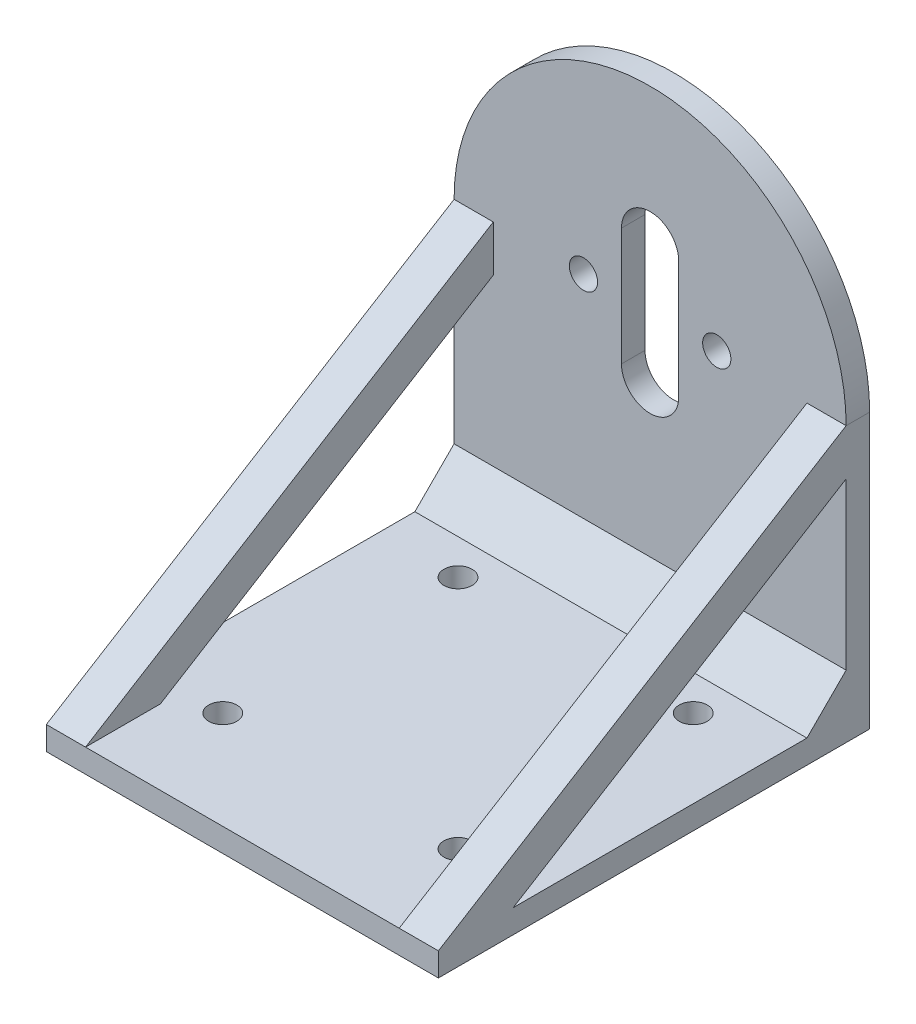
ISO-10303-21;
HEADER;
FILE_DESCRIPTION(('STEP AP214'),'2;1');
FILE_NAME('part.step','',(''),(''),'','','');
FILE_SCHEMA(('AUTOMOTIVE_DESIGN { 1 0 10303 214 1 1 1 1 }'));
ENDSEC;
DATA;
#1=APPLICATION_CONTEXT('core data for automotive mechanical design processes');
#2=APPLICATION_PROTOCOL_DEFINITION('international standard','automotive_design',2000,#1);
#3=PRODUCT_CONTEXT('',#1,'mechanical');
#4=PRODUCT('Part','Part','',(#3));
#5=PRODUCT_RELATED_PRODUCT_CATEGORY('part','',(#4));
#6=PRODUCT_DEFINITION_FORMATION('','',#4);
#7=PRODUCT_DEFINITION_CONTEXT('part definition',#1,'design');
#8=PRODUCT_DEFINITION('design','',#6,#7);
#9=PRODUCT_DEFINITION_SHAPE('','',#8);
#10=(LENGTH_UNIT() NAMED_UNIT(*) SI_UNIT(.MILLI.,.METRE.));
#11=(NAMED_UNIT(*) PLANE_ANGLE_UNIT() SI_UNIT($,.RADIAN.));
#12=(NAMED_UNIT(*) SI_UNIT($,.STERADIAN.) SOLID_ANGLE_UNIT());
#13=UNCERTAINTY_MEASURE_WITH_UNIT(LENGTH_MEASURE(1.E-05),#10,'distance_accuracy_value','');
#14=(GEOMETRIC_REPRESENTATION_CONTEXT(3) GLOBAL_UNCERTAINTY_ASSIGNED_CONTEXT((#13)) GLOBAL_UNIT_ASSIGNED_CONTEXT((#10,
#11,#12)) REPRESENTATION_CONTEXT('',''));
#15=CARTESIAN_POINT('',(0.,0.,0.));
#16=DIRECTION('',(0.,0.,1.));
#17=DIRECTION('',(1.,0.,0.));
#18=AXIS2_PLACEMENT_3D('',#15,#16,#17);
#19=CARTESIAN_POINT('',(25.,35.,3.));
#20=DIRECTION('',(0.,0.,1.));
#21=DIRECTION('',(1.,0.,0.));
#22=AXIS2_PLACEMENT_3D('',#19,#20,#21);
#23=PLANE('',#22);
#24=CARTESIAN_POINT('',(16.5,35.,3.));
#25=DIRECTION('',(0.,0.,1.));
#26=DIRECTION('',(1.,0.,0.));
#27=AXIS2_PLACEMENT_3D('',#24,#25,#26);
#28=CIRCLE('',#27,1.8);
#29=CARTESIAN_POINT('',(18.3,35.,3.));
#30=VERTEX_POINT('',#29);
#31=EDGE_CURVE('E296',#30,#30,#28,.T.);
#32=ORIENTED_EDGE('',*,*,#31,.F.);
#33=EDGE_LOOP('',(#32));
#34=FACE_BOUND('',#33,.T.);
#35=CARTESIAN_POINT('',(33.5,35.,3.));
#36=DIRECTION('',(0.,0.,1.));
#37=DIRECTION('',(1.,0.,0.));
#38=AXIS2_PLACEMENT_3D('',#35,#36,#37);
#39=CIRCLE('',#38,1.8);
#40=CARTESIAN_POINT('',(35.3,35.,3.));
#41=VERTEX_POINT('',#40);
#42=EDGE_CURVE('E290',#41,#41,#39,.T.);
#43=ORIENTED_EDGE('',*,*,#42,.F.);
#44=EDGE_LOOP('',(#43));
#45=FACE_BOUND('',#44,.T.);
#46=DIRECTION('',(0.,-1.,0.));
#47=VECTOR('',#46,1.);
#48=CARTESIAN_POINT('',(21.35,42.5,3.));
#49=LINE('',#48,#47);
#50=CARTESIAN_POINT('',(21.35,42.5,3.));
#51=VERTEX_POINT('',#50);
#52=CARTESIAN_POINT('',(21.35,27.5,3.));
#53=VERTEX_POINT('',#52);
#54=EDGE_CURVE('E261',#51,#53,#49,.T.);
#55=ORIENTED_EDGE('',*,*,#54,.F.);
#56=CARTESIAN_POINT('',(25.,42.5,3.));
#57=DIRECTION('',(0.,0.,1.));
#58=DIRECTION('',(1.,0.,0.));
#59=AXIS2_PLACEMENT_3D('',#56,#57,#58);
#60=CIRCLE('',#59,3.65);
#61=CARTESIAN_POINT('',(28.65,42.5,3.));
#62=VERTEX_POINT('',#61);
#63=EDGE_CURVE('E259',#62,#51,#60,.T.);
#64=ORIENTED_EDGE('',*,*,#63,.F.);
#65=DIRECTION('',(0.,1.,0.));
#66=VECTOR('',#65,1.);
#67=CARTESIAN_POINT('',(28.65,42.5,3.));
#68=LINE('',#67,#66);
#69=CARTESIAN_POINT('',(28.65,27.5,3.));
#70=VERTEX_POINT('',#69);
#71=EDGE_CURVE('E267',#70,#62,#68,.T.);
#72=ORIENTED_EDGE('',*,*,#71,.F.);
#73=CARTESIAN_POINT('',(25.,27.5,3.));
#74=DIRECTION('',(0.,0.,1.));
#75=DIRECTION('',(1.,0.,0.));
#76=AXIS2_PLACEMENT_3D('',#73,#74,#75);
#77=CIRCLE('',#76,3.65);
#78=EDGE_CURVE('E264',#53,#70,#77,.T.);
#79=ORIENTED_EDGE('',*,*,#78,.F.);
#80=EDGE_LOOP('',(#55,#64,#72,#79));
#81=FACE_BOUND('',#80,.T.);
#82=DIRECTION('',(0.,-1.,0.));
#83=VECTOR('',#82,1.);
#84=CARTESIAN_POINT('',(0.,0.,3.));
#85=LINE('',#84,#83);
#86=CARTESIAN_POINT('',(0.,29.1291009528947,3.));
#87=VERTEX_POINT('',#86);
#88=CARTESIAN_POINT('',(0.,8.,3.));
#89=VERTEX_POINT('',#88);
#90=EDGE_CURVE('E307',#87,#89,#85,.T.);
#91=ORIENTED_EDGE('',*,*,#90,.T.);
#92=DIRECTION('',(1.,0.,0.));
#93=VECTOR('',#92,1.);
#94=CARTESIAN_POINT('',(50.,8.,3.));
#95=LINE('',#94,#93);
#96=CARTESIAN_POINT('',(50.,8.,3.));
#97=VERTEX_POINT('',#96);
#98=EDGE_CURVE('E57',#89,#97,#95,.T.);
#99=ORIENTED_EDGE('',*,*,#98,.T.);
#100=DIRECTION('',(0.,1.,0.));
#101=VECTOR('',#100,1.);
#102=CARTESIAN_POINT('',(50.,0.,3.));
#103=LINE('',#102,#101);
#104=CARTESIAN_POINT('',(50.,29.1291009528947,3.));
#105=VERTEX_POINT('',#104);
#106=EDGE_CURVE('E302',#97,#105,#103,.T.);
#107=ORIENTED_EDGE('',*,*,#106,.T.);
#108=DIRECTION('',(1.,0.,0.));
#109=VECTOR('',#108,1.);
#110=CARTESIAN_POINT('',(45.,29.1291009528947,3.));
#111=LINE('',#110,#109);
#112=CARTESIAN_POINT('',(45.,29.1291009528947,3.));
#113=VERTEX_POINT('',#112);
#114=EDGE_CURVE('E212',#113,#105,#111,.T.);
#115=ORIENTED_EDGE('',*,*,#114,.F.);
#116=DIRECTION('',(0.,1.,0.));
#117=VECTOR('',#116,1.);
#118=CARTESIAN_POINT('',(45.,29.1291009528947,3.));
#119=LINE('',#118,#117);
#120=CARTESIAN_POINT('',(45.,35.,3.));
#121=VERTEX_POINT('',#120);
#122=EDGE_CURVE('E195',#113,#121,#119,.T.);
#123=ORIENTED_EDGE('',*,*,#122,.T.);
#124=DIRECTION('',(1.,0.,0.));
#125=VECTOR('',#124,1.);
#126=CARTESIAN_POINT('',(45.,35.,3.));
#127=LINE('',#126,#125);
#128=CARTESIAN_POINT('',(50.,35.,3.));
#129=VERTEX_POINT('',#128);
#130=EDGE_CURVE('E207',#121,#129,#127,.T.);
#131=ORIENTED_EDGE('',*,*,#130,.T.);
#132=CARTESIAN_POINT('',(25.,35.,3.));
#133=DIRECTION('',(0.,0.,1.));
#134=DIRECTION('',(1.,0.,0.));
#135=AXIS2_PLACEMENT_3D('',#132,#133,#134);
#136=CIRCLE('',#135,25.);
#137=CARTESIAN_POINT('',(0.,35.,3.));
#138=VERTEX_POINT('',#137);
#139=EDGE_CURVE('E304',#129,#138,#136,.T.);
#140=ORIENTED_EDGE('',*,*,#139,.T.);
#141=DIRECTION('',(-1.,0.,0.));
#142=VECTOR('',#141,1.);
#143=CARTESIAN_POINT('',(4.99999999999999,35.,3.));
#144=LINE('',#143,#142);
#145=CARTESIAN_POINT('',(4.99999999999999,35.,3.));
#146=VERTEX_POINT('',#145);
#147=EDGE_CURVE('E190',#146,#138,#144,.T.);
#148=ORIENTED_EDGE('',*,*,#147,.F.);
#149=DIRECTION('',(0.,1.,0.));
#150=VECTOR('',#149,1.);
#151=CARTESIAN_POINT('',(4.99999999999999,29.1291009528947,3.));
#152=LINE('',#151,#150);
#153=CARTESIAN_POINT('',(5.,29.1291009528947,3.));
#154=VERTEX_POINT('',#153);
#155=EDGE_CURVE('E181',#154,#146,#152,.T.);
#156=ORIENTED_EDGE('',*,*,#155,.F.);
#157=DIRECTION('',(-1.,0.,0.));
#158=VECTOR('',#157,1.);
#159=CARTESIAN_POINT('',(4.99999999999999,29.1291009528947,3.));
#160=LINE('',#159,#158);
#161=EDGE_CURVE('E180',#154,#87,#160,.T.);
#162=ORIENTED_EDGE('',*,*,#161,.T.);
#163=EDGE_LOOP('',(#91,#99,#107,#115,#123,#131,#140,#148,#156,#162));
#164=FACE_BOUND('',#163,.T.);
#165=ADVANCED_FACE('F41',(#34,#45,#81,#164),#23,.T.);
#166=CARTESIAN_POINT('',(0.,3.,0.));
#167=DIRECTION('',(0.,1.,0.));
#168=DIRECTION('',(0.,0.,1.));
#169=AXIS2_PLACEMENT_3D('',#166,#167,#168);
#170=PLANE('',#169);
#171=CARTESIAN_POINT('',(40.,3.,12.5));
#172=DIRECTION('',(0.,1.,0.));
#173=DIRECTION('',(0.,0.,1.));
#174=AXIS2_PLACEMENT_3D('',#171,#172,#173);
#175=CIRCLE('',#174,1.79999999999999);
#176=CARTESIAN_POINT('',(40.,3.,14.3));
#177=VERTEX_POINT('',#176);
#178=EDGE_CURVE('E223',#177,#177,#175,.T.);
#179=ORIENTED_EDGE('',*,*,#178,.F.);
#180=EDGE_LOOP('',(#179));
#181=FACE_BOUND('',#180,.T.);
#182=CARTESIAN_POINT('',(40.,3.,42.5));
#183=DIRECTION('',(0.,1.,0.));
#184=DIRECTION('',(0.,0.,1.));
#185=AXIS2_PLACEMENT_3D('',#182,#183,#184);
#186=CIRCLE('',#185,1.79999999999999);
#187=CARTESIAN_POINT('',(40.,3.,44.3));
#188=VERTEX_POINT('',#187);
#189=EDGE_CURVE('E229',#188,#188,#186,.T.);
#190=ORIENTED_EDGE('',*,*,#189,.F.);
#191=EDGE_LOOP('',(#190));
#192=FACE_BOUND('',#191,.T.);
#193=CARTESIAN_POINT('',(10.,3.,12.5));
#194=DIRECTION('',(0.,1.,0.));
#195=DIRECTION('',(0.,0.,1.));
#196=AXIS2_PLACEMENT_3D('',#193,#194,#195);
#197=CIRCLE('',#196,1.79999999999999);
#198=CARTESIAN_POINT('',(10.,3.,14.3));
#199=VERTEX_POINT('',#198);
#200=EDGE_CURVE('E235',#199,#199,#197,.T.);
#201=ORIENTED_EDGE('',*,*,#200,.F.);
#202=EDGE_LOOP('',(#201));
#203=FACE_BOUND('',#202,.T.);
#204=CARTESIAN_POINT('',(10.,3.,42.5));
#205=DIRECTION('',(0.,1.,0.));
#206=DIRECTION('',(0.,0.,1.));
#207=AXIS2_PLACEMENT_3D('',#204,#205,#206);
#208=CIRCLE('',#207,1.79999999999999);
#209=CARTESIAN_POINT('',(10.,3.,44.3));
#210=VERTEX_POINT('',#209);
#211=EDGE_CURVE('E239',#210,#210,#208,.T.);
#212=ORIENTED_EDGE('',*,*,#211,.F.);
#213=EDGE_LOOP('',(#212));
#214=FACE_BOUND('',#213,.T.);
#215=DIRECTION('',(0.,0.,1.));
#216=VECTOR('',#215,1.);
#217=CARTESIAN_POINT('',(50.,3.,0.));
#218=LINE('',#217,#216);
#219=CARTESIAN_POINT('',(50.,3.,8.00000000000004));
#220=VERTEX_POINT('',#219);
#221=CARTESIAN_POINT('',(50.,3.00000000000001,45.4597890484539));
#222=VERTEX_POINT('',#221);
#223=EDGE_CURVE('E244',#220,#222,#218,.T.);
#224=ORIENTED_EDGE('',*,*,#223,.F.);
#225=DIRECTION('',(-1.,0.,0.));
#226=VECTOR('',#225,1.);
#227=CARTESIAN_POINT('',(0.,3.,8.00000000000004));
#228=LINE('',#227,#226);
#229=CARTESIAN_POINT('',(0.,3.,8.00000000000004));
#230=VERTEX_POINT('',#229);
#231=EDGE_CURVE('E328',#220,#230,#228,.T.);
#232=ORIENTED_EDGE('',*,*,#231,.T.);
#233=DIRECTION('',(0.,0.,-1.));
#234=VECTOR('',#233,1.);
#235=CARTESIAN_POINT('',(0.,3.,0.));
#236=LINE('',#235,#234);
#237=CARTESIAN_POINT('',(0.,3.,45.4597890484539));
#238=VERTEX_POINT('',#237);
#239=EDGE_CURVE('E186',#238,#230,#236,.T.);
#240=ORIENTED_EDGE('',*,*,#239,.F.);
#241=DIRECTION('',(-1.,0.,0.));
#242=VECTOR('',#241,1.);
#243=CARTESIAN_POINT('',(5.,3.,45.4597890484539));
#244=LINE('',#243,#242);
#245=CARTESIAN_POINT('',(5.,3.,45.4597890484539));
#246=VERTEX_POINT('',#245);
#247=EDGE_CURVE('E177',#246,#238,#244,.T.);
#248=ORIENTED_EDGE('',*,*,#247,.F.);
#249=DIRECTION('',(0.,0.,-1.));
#250=VECTOR('',#249,1.);
#251=CARTESIAN_POINT('',(5.,3.,55.));
#252=LINE('',#251,#250);
#253=CARTESIAN_POINT('',(5.,3.,55.));
#254=VERTEX_POINT('',#253);
#255=EDGE_CURVE('E159',#254,#246,#252,.T.);
#256=ORIENTED_EDGE('',*,*,#255,.F.);
#257=DIRECTION('',(-1.,0.,0.));
#258=VECTOR('',#257,1.);
#259=CARTESIAN_POINT('',(0.,3.,55.));
#260=LINE('',#259,#258);
#261=CARTESIAN_POINT('',(45.,3.00000000000001,55.));
#262=VERTEX_POINT('',#261);
#263=EDGE_CURVE('E246',#262,#254,#260,.T.);
#264=ORIENTED_EDGE('',*,*,#263,.F.);
#265=DIRECTION('',(0.,0.,-1.));
#266=VECTOR('',#265,1.);
#267=CARTESIAN_POINT('',(45.,3.00000000000001,55.));
#268=LINE('',#267,#266);
#269=CARTESIAN_POINT('',(45.,3.00000000000001,45.4597890484539));
#270=VERTEX_POINT('',#269);
#271=EDGE_CURVE('E201',#262,#270,#268,.T.);
#272=ORIENTED_EDGE('',*,*,#271,.T.);
#273=DIRECTION('',(1.,0.,0.));
#274=VECTOR('',#273,1.);
#275=CARTESIAN_POINT('',(45.,3.00000000000001,45.4597890484539));
#276=LINE('',#275,#274);
#277=EDGE_CURVE('E216',#270,#222,#276,.T.);
#278=ORIENTED_EDGE('',*,*,#277,.T.);
#279=EDGE_LOOP('',(#224,#232,#240,#248,#256,#264,#272,#278));
#280=FACE_BOUND('',#279,.T.);
#281=ADVANCED_FACE('F184',(#181,#192,#203,#214,#280),#170,.T.);
#282=CARTESIAN_POINT('',(25.,35.,0.));
#283=DIRECTION('',(0.,0.,1.));
#284=DIRECTION('',(1.,0.,0.));
#285=AXIS2_PLACEMENT_3D('',#282,#283,#284);
#286=PLANE('',#285);
#287=CARTESIAN_POINT('',(33.5,35.,0.));
#288=DIRECTION('',(0.,0.,1.));
#289=DIRECTION('',(1.,0.,0.));
#290=AXIS2_PLACEMENT_3D('',#287,#288,#289);
#291=CIRCLE('',#290,1.8);
#292=CARTESIAN_POINT('',(35.3,35.,0.));
#293=VERTEX_POINT('',#292);
#294=EDGE_CURVE('E289',#293,#293,#291,.T.);
#295=ORIENTED_EDGE('',*,*,#294,.T.);
#296=EDGE_LOOP('',(#295));
#297=FACE_BOUND('',#296,.T.);
#298=CARTESIAN_POINT('',(16.5,35.,0.));
#299=DIRECTION('',(0.,0.,1.));
#300=DIRECTION('',(1.,0.,0.));
#301=AXIS2_PLACEMENT_3D('',#298,#299,#300);
#302=CIRCLE('',#301,1.8);
#303=CARTESIAN_POINT('',(18.3,35.,0.));
#304=VERTEX_POINT('',#303);
#305=EDGE_CURVE('E293',#304,#304,#302,.T.);
#306=ORIENTED_EDGE('',*,*,#305,.T.);
#307=EDGE_LOOP('',(#306));
#308=FACE_BOUND('',#307,.T.);
#309=CARTESIAN_POINT('',(25.,35.,0.));
#310=DIRECTION('',(0.,0.,1.));
#311=DIRECTION('',(1.,0.,0.));
#312=AXIS2_PLACEMENT_3D('',#309,#310,#311);
#313=CIRCLE('',#312,25.);
#314=CARTESIAN_POINT('',(50.,35.,0.));
#315=VERTEX_POINT('',#314);
#316=CARTESIAN_POINT('',(0.,35.,0.));
#317=VERTEX_POINT('',#316);
#318=EDGE_CURVE('E314',#315,#317,#313,.T.);
#319=ORIENTED_EDGE('',*,*,#318,.F.);
#320=DIRECTION('',(0.,1.,0.));
#321=VECTOR('',#320,1.);
#322=CARTESIAN_POINT('',(50.,0.,0.));
#323=LINE('',#322,#321);
#324=CARTESIAN_POINT('',(50.,0.,0.));
#325=VERTEX_POINT('',#324);
#326=EDGE_CURVE('E312',#325,#315,#323,.T.);
#327=ORIENTED_EDGE('',*,*,#326,.F.);
#328=DIRECTION('',(1.,0.,0.));
#329=VECTOR('',#328,1.);
#330=CARTESIAN_POINT('',(0.,0.,0.));
#331=LINE('',#330,#329);
#332=CARTESIAN_POINT('',(0.,0.,0.));
#333=VERTEX_POINT('',#332);
#334=EDGE_CURVE('E299',#333,#325,#331,.T.);
#335=ORIENTED_EDGE('',*,*,#334,.F.);
#336=DIRECTION('',(0.,-1.,0.));
#337=VECTOR('',#336,1.);
#338=CARTESIAN_POINT('',(0.,0.,0.));
#339=LINE('',#338,#337);
#340=EDGE_CURVE('E305',#317,#333,#339,.T.);
#341=ORIENTED_EDGE('',*,*,#340,.F.);
#342=EDGE_LOOP('',(#319,#327,#335,#341));
#343=FACE_BOUND('',#342,.T.);
#344=CARTESIAN_POINT('',(25.,42.5,0.));
#345=DIRECTION('',(0.,0.,1.));
#346=DIRECTION('',(1.,0.,0.));
#347=AXIS2_PLACEMENT_3D('',#344,#345,#346);
#348=CIRCLE('',#347,3.65);
#349=CARTESIAN_POINT('',(28.65,42.5,0.));
#350=VERTEX_POINT('',#349);
#351=CARTESIAN_POINT('',(21.35,42.5,0.));
#352=VERTEX_POINT('',#351);
#353=EDGE_CURVE('E256',#350,#352,#348,.T.);
#354=ORIENTED_EDGE('',*,*,#353,.T.);
#355=DIRECTION('',(0.,-1.,0.));
#356=VECTOR('',#355,1.);
#357=CARTESIAN_POINT('',(21.35,42.5,0.));
#358=LINE('',#357,#356);
#359=CARTESIAN_POINT('',(21.35,27.5,0.));
#360=VERTEX_POINT('',#359);
#361=EDGE_CURVE('E272',#352,#360,#358,.T.);
#362=ORIENTED_EDGE('',*,*,#361,.T.);
#363=CARTESIAN_POINT('',(25.,27.5,0.));
#364=DIRECTION('',(0.,0.,1.));
#365=DIRECTION('',(1.,0.,0.));
#366=AXIS2_PLACEMENT_3D('',#363,#364,#365);
#367=CIRCLE('',#366,3.65);
#368=CARTESIAN_POINT('',(28.65,27.5,0.));
#369=VERTEX_POINT('',#368);
#370=EDGE_CURVE('E275',#360,#369,#367,.T.);
#371=ORIENTED_EDGE('',*,*,#370,.T.);
#372=DIRECTION('',(0.,1.,0.));
#373=VECTOR('',#372,1.);
#374=CARTESIAN_POINT('',(28.65,42.5,0.));
#375=LINE('',#374,#373);
#376=EDGE_CURVE('E262',#369,#350,#375,.T.);
#377=ORIENTED_EDGE('',*,*,#376,.T.);
#378=EDGE_LOOP('',(#354,#362,#371,#377));
#379=FACE_BOUND('',#378,.T.);
#380=ADVANCED_FACE('F388',(#297,#308,#343,#379),#286,.F.);
#381=CARTESIAN_POINT('',(0.,0.,3.));
#382=DIRECTION('',(0.,1.,0.));
#383=DIRECTION('',(0.,0.,1.));
#384=AXIS2_PLACEMENT_3D('',#381,#382,#383);
#385=PLANE('',#384);
#386=CARTESIAN_POINT('',(40.,0.,12.5));
#387=DIRECTION('',(0.,-1.,0.));
#388=DIRECTION('',(0.,0.,-1.));
#389=AXIS2_PLACEMENT_3D('',#386,#387,#388);
#390=CIRCLE('',#389,1.8);
#391=CARTESIAN_POINT('',(40.,0.,10.7));
#392=VERTEX_POINT('',#391);
#393=EDGE_CURVE('E215',#392,#392,#390,.T.);
#394=ORIENTED_EDGE('',*,*,#393,.F.);
#395=EDGE_LOOP('',(#394));
#396=FACE_BOUND('',#395,.T.);
#397=CARTESIAN_POINT('',(40.,0.,42.5));
#398=DIRECTION('',(0.,-1.,0.));
#399=DIRECTION('',(0.,0.,-1.));
#400=AXIS2_PLACEMENT_3D('',#397,#398,#399);
#401=CIRCLE('',#400,1.8);
#402=CARTESIAN_POINT('',(40.,0.,40.7));
#403=VERTEX_POINT('',#402);
#404=EDGE_CURVE('E226',#403,#403,#401,.T.);
#405=ORIENTED_EDGE('',*,*,#404,.F.);
#406=EDGE_LOOP('',(#405));
#407=FACE_BOUND('',#406,.T.);
#408=CARTESIAN_POINT('',(10.,0.,12.5));
#409=DIRECTION('',(0.,-1.,0.));
#410=DIRECTION('',(0.,0.,-1.));
#411=AXIS2_PLACEMENT_3D('',#408,#409,#410);
#412=CIRCLE('',#411,1.79999999999999);
#413=CARTESIAN_POINT('',(10.,0.,10.7));
#414=VERTEX_POINT('',#413);
#415=EDGE_CURVE('E232',#414,#414,#412,.T.);
#416=ORIENTED_EDGE('',*,*,#415,.F.);
#417=EDGE_LOOP('',(#416));
#418=FACE_BOUND('',#417,.T.);
#419=CARTESIAN_POINT('',(10.,0.,42.5));
#420=DIRECTION('',(0.,-1.,0.));
#421=DIRECTION('',(0.,0.,-1.));
#422=AXIS2_PLACEMENT_3D('',#419,#420,#421);
#423=CIRCLE('',#422,1.79999999999999);
#424=CARTESIAN_POINT('',(10.,0.,40.7));
#425=VERTEX_POINT('',#424);
#426=EDGE_CURVE('E236',#425,#425,#423,.T.);
#427=ORIENTED_EDGE('',*,*,#426,.F.);
#428=EDGE_LOOP('',(#427));
#429=FACE_BOUND('',#428,.T.);
#430=ORIENTED_EDGE('',*,*,#334,.T.);
#431=DIRECTION('',(0.,0.,-1.));
#432=VECTOR('',#431,1.);
#433=CARTESIAN_POINT('',(50.,0.,3.));
#434=LINE('',#433,#432);
#435=CARTESIAN_POINT('',(50.,0.,55.));
#436=VERTEX_POINT('',#435);
#437=EDGE_CURVE('E325',#436,#325,#434,.T.);
#438=ORIENTED_EDGE('',*,*,#437,.F.);
#439=DIRECTION('',(-1.,0.,0.));
#440=VECTOR('',#439,1.);
#441=CARTESIAN_POINT('',(0.,0.,55.));
#442=LINE('',#441,#440);
#443=CARTESIAN_POINT('',(0.,0.,55.));
#444=VERTEX_POINT('',#443);
#445=EDGE_CURVE('E242',#436,#444,#442,.T.);
#446=ORIENTED_EDGE('',*,*,#445,.T.);
#447=DIRECTION('',(0.,0.,-1.));
#448=VECTOR('',#447,1.);
#449=CARTESIAN_POINT('',(0.,0.,3.));
#450=LINE('',#449,#448);
#451=EDGE_CURVE('E309',#444,#333,#450,.T.);
#452=ORIENTED_EDGE('',*,*,#451,.T.);
#453=EDGE_LOOP('',(#430,#438,#446,#452));
#454=FACE_BOUND('',#453,.T.);
#455=ADVANCED_FACE('F360',(#396,#407,#418,#429,#454),#385,.F.);
#456=CARTESIAN_POINT('',(50.,0.,3.));
#457=DIRECTION('',(-1.,0.,0.));
#458=DIRECTION('',(0.,-1.,0.));
#459=AXIS2_PLACEMENT_3D('',#456,#457,#458);
#460=PLANE('',#459);
#461=DIRECTION('',(0.,0.,-1.));
#462=VECTOR('',#461,1.);
#463=CARTESIAN_POINT('',(50.,35.,3.));
#464=LINE('',#463,#462);
#465=EDGE_CURVE('E322',#129,#315,#464,.T.);
#466=ORIENTED_EDGE('',*,*,#465,.F.);
#467=DIRECTION('',(0.,-0.524097425664335,0.851658316704544));
#468=VECTOR('',#467,1.);
#469=CARTESIAN_POINT('',(50.,35.,3.));
#470=LINE('',#469,#468);
#471=CARTESIAN_POINT('',(50.,3.,55.));
#472=VERTEX_POINT('',#471);
#473=EDGE_CURVE('E208',#129,#472,#470,.T.);
#474=ORIENTED_EDGE('',*,*,#473,.T.);
#475=DIRECTION('',(0.,-1.,0.));
#476=VECTOR('',#475,1.);
#477=CARTESIAN_POINT('',(50.,3.,55.));
#478=LINE('',#477,#476);
#479=EDGE_CURVE('E250',#472,#436,#478,.T.);
#480=ORIENTED_EDGE('',*,*,#479,.T.);
#481=ORIENTED_EDGE('',*,*,#437,.T.);
#482=ORIENTED_EDGE('',*,*,#326,.T.);
#483=EDGE_LOOP('',(#466,#474,#480,#481,#482));
#484=FACE_BOUND('',#483,.T.);
#485=ORIENTED_EDGE('',*,*,#106,.F.);
#486=DIRECTION('',(0.,0.707106781186545,-0.70710678118655));
#487=VECTOR('',#486,1.);
#488=CARTESIAN_POINT('',(50.,4.00000000000004,7.));
#489=LINE('',#488,#487);
#490=EDGE_CURVE('E11',#97,#220,#489,.F.);
#491=ORIENTED_EDGE('',*,*,#490,.T.);
#492=ORIENTED_EDGE('',*,*,#223,.T.);
#493=DIRECTION('',(0.,0.524097425664335,-0.851658316704544));
#494=VECTOR('',#493,1.);
#495=CARTESIAN_POINT('',(50.,3.00000000000001,45.4597890484539));
#496=LINE('',#495,#494);
#497=EDGE_CURVE('E198',#222,#105,#496,.T.);
#498=ORIENTED_EDGE('',*,*,#497,.T.);
#499=EDGE_LOOP('',(#485,#491,#492,#498));
#500=FACE_BOUND('',#499,.T.);
#501=ADVANCED_FACE('F363',(#484,#500),#460,.F.);
#502=CARTESIAN_POINT('',(25.,35.,3.));
#503=DIRECTION('',(0.,0.,-1.));
#504=DIRECTION('',(-1.,0.,0.));
#505=AXIS2_PLACEMENT_3D('',#502,#503,#504);
#506=CYLINDRICAL_SURFACE('',#505,25.);
#507=ORIENTED_EDGE('',*,*,#318,.T.);
#508=DIRECTION('',(0.,0.,-1.));
#509=VECTOR('',#508,1.);
#510=CARTESIAN_POINT('',(0.,35.,3.));
#511=LINE('',#510,#509);
#512=EDGE_CURVE('E319',#138,#317,#511,.T.);
#513=ORIENTED_EDGE('',*,*,#512,.F.);
#514=ORIENTED_EDGE('',*,*,#139,.F.);
#515=ORIENTED_EDGE('',*,*,#465,.T.);
#516=EDGE_LOOP('',(#507,#513,#514,#515));
#517=FACE_BOUND('',#516,.T.);
#518=ADVANCED_FACE('F351',(#517),#506,.T.);
#519=CARTESIAN_POINT('',(0.,0.,3.));
#520=DIRECTION('',(1.,0.,0.));
#521=DIRECTION('',(0.,0.,-1.));
#522=AXIS2_PLACEMENT_3D('',#519,#520,#521);
#523=PLANE('',#522);
#524=ORIENTED_EDGE('',*,*,#90,.F.);
#525=DIRECTION('',(0.,0.524097425664335,-0.851658316704544));
#526=VECTOR('',#525,1.);
#527=CARTESIAN_POINT('',(0.,3.,45.4597890484539));
#528=LINE('',#527,#526);
#529=EDGE_CURVE('E337',#238,#87,#528,.T.);
#530=ORIENTED_EDGE('',*,*,#529,.F.);
#531=ORIENTED_EDGE('',*,*,#239,.T.);
#532=DIRECTION('',(0.,-0.707106781186545,0.70710678118655));
#533=VECTOR('',#532,1.);
#534=CARTESIAN_POINT('',(0.,4.00000000000004,7.));
#535=LINE('',#534,#533);
#536=EDGE_CURVE('E50',#230,#89,#535,.F.);
#537=ORIENTED_EDGE('',*,*,#536,.T.);
#538=EDGE_LOOP('',(#524,#530,#531,#537));
#539=FACE_BOUND('',#538,.T.);
#540=ORIENTED_EDGE('',*,*,#340,.T.);
#541=ORIENTED_EDGE('',*,*,#451,.F.);
#542=DIRECTION('',(0.,-1.,0.));
#543=VECTOR('',#542,1.);
#544=CARTESIAN_POINT('',(0.,3.,55.));
#545=LINE('',#544,#543);
#546=CARTESIAN_POINT('',(0.,3.,55.));
#547=VERTEX_POINT('',#546);
#548=EDGE_CURVE('E253',#547,#444,#545,.T.);
#549=ORIENTED_EDGE('',*,*,#548,.F.);
#550=DIRECTION('',(0.,-0.524097425664335,0.851658316704544));
#551=VECTOR('',#550,1.);
#552=CARTESIAN_POINT('',(0.,35.,3.));
#553=LINE('',#552,#551);
#554=EDGE_CURVE('E338',#138,#547,#553,.T.);
#555=ORIENTED_EDGE('',*,*,#554,.F.);
#556=ORIENTED_EDGE('',*,*,#512,.T.);
#557=EDGE_LOOP('',(#540,#541,#549,#555,#556));
#558=FACE_BOUND('',#557,.T.);
#559=ADVANCED_FACE('F335',(#539,#558),#523,.F.);
#560=CARTESIAN_POINT('',(16.5,35.,3.));
#561=DIRECTION('',(0.,0.,-1.));
#562=DIRECTION('',(-1.,0.,0.));
#563=AXIS2_PLACEMENT_3D('',#560,#561,#562);
#564=CYLINDRICAL_SURFACE('',#563,1.8);
#565=ORIENTED_EDGE('',*,*,#31,.T.);
#566=EDGE_LOOP('',(#565));
#567=FACE_BOUND('',#566,.T.);
#568=ORIENTED_EDGE('',*,*,#305,.F.);
#569=EDGE_LOOP('',(#568));
#570=FACE_BOUND('',#569,.T.);
#571=ADVANCED_FACE('F395',(#567,#570),#564,.F.);
#572=CARTESIAN_POINT('',(33.5,35.,3.));
#573=DIRECTION('',(0.,0.,-1.));
#574=DIRECTION('',(-1.,0.,0.));
#575=AXIS2_PLACEMENT_3D('',#572,#573,#574);
#576=CYLINDRICAL_SURFACE('',#575,1.8);
#577=ORIENTED_EDGE('',*,*,#42,.T.);
#578=EDGE_LOOP('',(#577));
#579=FACE_BOUND('',#578,.T.);
#580=ORIENTED_EDGE('',*,*,#294,.F.);
#581=EDGE_LOOP('',(#580));
#582=FACE_BOUND('',#581,.T.);
#583=ADVANCED_FACE('F445',(#579,#582),#576,.F.);
#584=CARTESIAN_POINT('',(25.,42.5,3.));
#585=DIRECTION('',(0.,0.,-1.));
#586=DIRECTION('',(-1.,0.,0.));
#587=AXIS2_PLACEMENT_3D('',#584,#585,#586);
#588=CYLINDRICAL_SURFACE('',#587,3.65);
#589=ORIENTED_EDGE('',*,*,#353,.F.);
#590=DIRECTION('',(0.,0.,-1.));
#591=VECTOR('',#590,1.);
#592=CARTESIAN_POINT('',(28.65,42.5,3.));
#593=LINE('',#592,#591);
#594=EDGE_CURVE('E269',#62,#350,#593,.T.);
#595=ORIENTED_EDGE('',*,*,#594,.F.);
#596=ORIENTED_EDGE('',*,*,#63,.T.);
#597=DIRECTION('',(0.,0.,-1.));
#598=VECTOR('',#597,1.);
#599=CARTESIAN_POINT('',(21.35,42.5,3.));
#600=LINE('',#599,#598);
#601=EDGE_CURVE('E286',#51,#352,#600,.T.);
#602=ORIENTED_EDGE('',*,*,#601,.T.);
#603=EDGE_LOOP('',(#589,#595,#596,#602));
#604=FACE_BOUND('',#603,.T.);
#605=ADVANCED_FACE('F442',(#604),#588,.F.);
#606=CARTESIAN_POINT('',(21.35,42.5,3.));
#607=DIRECTION('',(1.,0.,0.));
#608=DIRECTION('',(0.,0.,-1.));
#609=AXIS2_PLACEMENT_3D('',#606,#607,#608);
#610=PLANE('',#609);
#611=ORIENTED_EDGE('',*,*,#361,.F.);
#612=ORIENTED_EDGE('',*,*,#601,.F.);
#613=ORIENTED_EDGE('',*,*,#54,.T.);
#614=DIRECTION('',(0.,0.,-1.));
#615=VECTOR('',#614,1.);
#616=CARTESIAN_POINT('',(21.35,27.5,3.));
#617=LINE('',#616,#615);
#618=EDGE_CURVE('E284',#53,#360,#617,.T.);
#619=ORIENTED_EDGE('',*,*,#618,.T.);
#620=EDGE_LOOP('',(#611,#612,#613,#619));
#621=FACE_BOUND('',#620,.T.);
#622=ADVANCED_FACE('F438',(#621),#610,.T.);
#623=CARTESIAN_POINT('',(25.,27.5,3.));
#624=DIRECTION('',(0.,0.,-1.));
#625=DIRECTION('',(-1.,0.,0.));
#626=AXIS2_PLACEMENT_3D('',#623,#624,#625);
#627=CYLINDRICAL_SURFACE('',#626,3.65);
#628=ORIENTED_EDGE('',*,*,#370,.F.);
#629=ORIENTED_EDGE('',*,*,#618,.F.);
#630=ORIENTED_EDGE('',*,*,#78,.T.);
#631=DIRECTION('',(0.,0.,-1.));
#632=VECTOR('',#631,1.);
#633=CARTESIAN_POINT('',(28.65,27.5,3.));
#634=LINE('',#633,#632);
#635=EDGE_CURVE('E282',#70,#369,#634,.T.);
#636=ORIENTED_EDGE('',*,*,#635,.T.);
#637=EDGE_LOOP('',(#628,#629,#630,#636));
#638=FACE_BOUND('',#637,.T.);
#639=ADVANCED_FACE('F434',(#638),#627,.F.);
#640=CARTESIAN_POINT('',(28.65,42.5,3.));
#641=DIRECTION('',(-1.,0.,0.));
#642=DIRECTION('',(0.,0.,1.));
#643=AXIS2_PLACEMENT_3D('',#640,#641,#642);
#644=PLANE('',#643);
#645=ORIENTED_EDGE('',*,*,#376,.F.);
#646=ORIENTED_EDGE('',*,*,#635,.F.);
#647=ORIENTED_EDGE('',*,*,#71,.T.);
#648=ORIENTED_EDGE('',*,*,#594,.T.);
#649=EDGE_LOOP('',(#645,#646,#647,#648));
#650=FACE_BOUND('',#649,.T.);
#651=ADVANCED_FACE('F428',(#650),#644,.T.);
#652=CARTESIAN_POINT('',(0.,3.,55.));
#653=DIRECTION('',(0.,0.,1.));
#654=DIRECTION('',(1.,0.,0.));
#655=AXIS2_PLACEMENT_3D('',#652,#653,#654);
#656=PLANE('',#655);
#657=ORIENTED_EDGE('',*,*,#445,.F.);
#658=ORIENTED_EDGE('',*,*,#479,.F.);
#659=EDGE_CURVE('E247',#472,#262,#260,.T.);
#660=ORIENTED_EDGE('',*,*,#659,.T.);
#661=ORIENTED_EDGE('',*,*,#263,.T.);
#662=DIRECTION('',(-1.,0.,0.));
#663=VECTOR('',#662,1.);
#664=CARTESIAN_POINT('',(5.,3.,55.));
#665=LINE('',#664,#663);
#666=EDGE_CURVE('E187',#254,#547,#665,.T.);
#667=ORIENTED_EDGE('',*,*,#666,.T.);
#668=ORIENTED_EDGE('',*,*,#548,.T.);
#669=EDGE_LOOP('',(#657,#658,#660,#661,#667,#668));
#670=FACE_BOUND('',#669,.T.);
#671=ADVANCED_FACE('F357',(#670),#656,.T.);
#672=CARTESIAN_POINT('',(10.,0.,42.5));
#673=DIRECTION('',(0.,-1.,0.));
#674=DIRECTION('',(0.,0.,-1.));
#675=AXIS2_PLACEMENT_3D('',#672,#673,#674);
#676=CYLINDRICAL_SURFACE('',#675,1.79999999999999);
#677=ORIENTED_EDGE('',*,*,#211,.T.);
#678=EDGE_LOOP('',(#677));
#679=FACE_BOUND('',#678,.T.);
#680=ORIENTED_EDGE('',*,*,#426,.T.);
#681=EDGE_LOOP('',(#680));
#682=FACE_BOUND('',#681,.T.);
#683=ADVANCED_FACE('F418',(#679,#682),#676,.F.);
#684=CARTESIAN_POINT('',(10.,0.,12.5));
#685=DIRECTION('',(0.,-1.,0.));
#686=DIRECTION('',(0.,0.,-1.));
#687=AXIS2_PLACEMENT_3D('',#684,#685,#686);
#688=CYLINDRICAL_SURFACE('',#687,1.79999999999999);
#689=ORIENTED_EDGE('',*,*,#200,.T.);
#690=EDGE_LOOP('',(#689));
#691=FACE_BOUND('',#690,.T.);
#692=ORIENTED_EDGE('',*,*,#415,.T.);
#693=EDGE_LOOP('',(#692));
#694=FACE_BOUND('',#693,.T.);
#695=ADVANCED_FACE('F419',(#691,#694),#688,.F.);
#696=CARTESIAN_POINT('',(40.,0.,42.5));
#697=DIRECTION('',(0.,-1.,0.));
#698=DIRECTION('',(0.,0.,-1.));
#699=AXIS2_PLACEMENT_3D('',#696,#697,#698);
#700=CYLINDRICAL_SURFACE('',#699,1.79999999999999);
#701=ORIENTED_EDGE('',*,*,#189,.T.);
#702=EDGE_LOOP('',(#701));
#703=FACE_BOUND('',#702,.T.);
#704=ORIENTED_EDGE('',*,*,#404,.T.);
#705=EDGE_LOOP('',(#704));
#706=FACE_BOUND('',#705,.T.);
#707=ADVANCED_FACE('F424',(#703,#706),#700,.F.);
#708=CARTESIAN_POINT('',(40.,0.,12.5));
#709=DIRECTION('',(0.,-1.,0.));
#710=DIRECTION('',(0.,0.,-1.));
#711=AXIS2_PLACEMENT_3D('',#708,#709,#710);
#712=CYLINDRICAL_SURFACE('',#711,1.79999999999999);
#713=ORIENTED_EDGE('',*,*,#178,.T.);
#714=EDGE_LOOP('',(#713));
#715=FACE_BOUND('',#714,.T.);
#716=ORIENTED_EDGE('',*,*,#393,.T.);
#717=EDGE_LOOP('',(#716));
#718=FACE_BOUND('',#717,.T.);
#719=ADVANCED_FACE('F559',(#715,#718),#712,.F.);
#720=CARTESIAN_POINT('',(45.,3.00000000000001,45.4597890484539));
#721=DIRECTION('',(0.,-0.851658316704544,-0.524097425664335));
#722=DIRECTION('',(0.,0.524097425664335,-0.851658316704544));
#723=AXIS2_PLACEMENT_3D('',#720,#721,#722);
#724=PLANE('',#723);
#725=ORIENTED_EDGE('',*,*,#497,.F.);
#726=ORIENTED_EDGE('',*,*,#277,.F.);
#727=DIRECTION('',(0.,0.524097425664335,-0.851658316704544));
#728=VECTOR('',#727,1.);
#729=CARTESIAN_POINT('',(45.,3.00000000000001,45.4597890484539));
#730=LINE('',#729,#728);
#731=EDGE_CURVE('E204',#270,#113,#730,.T.);
#732=ORIENTED_EDGE('',*,*,#731,.T.);
#733=ORIENTED_EDGE('',*,*,#114,.T.);
#734=EDGE_LOOP('',(#725,#726,#732,#733));
#735=FACE_BOUND('',#734,.T.);
#736=ADVANCED_FACE('F375',(#735),#724,.T.);
#737=CARTESIAN_POINT('',(45.,35.,3.));
#738=DIRECTION('',(0.,0.851658316704544,0.524097425664335));
#739=DIRECTION('',(0.,-0.524097425664335,0.851658316704544));
#740=AXIS2_PLACEMENT_3D('',#737,#738,#739);
#741=PLANE('',#740);
#742=ORIENTED_EDGE('',*,*,#473,.F.);
#743=ORIENTED_EDGE('',*,*,#130,.F.);
#744=DIRECTION('',(0.,-0.524097425664335,0.851658316704544));
#745=VECTOR('',#744,1.);
#746=CARTESIAN_POINT('',(45.,35.,3.));
#747=LINE('',#746,#745);
#748=EDGE_CURVE('E197',#121,#262,#747,.T.);
#749=ORIENTED_EDGE('',*,*,#748,.T.);
#750=ORIENTED_EDGE('',*,*,#659,.F.);
#751=EDGE_LOOP('',(#742,#743,#749,#750));
#752=FACE_BOUND('',#751,.T.);
#753=ADVANCED_FACE('F367',(#752),#741,.T.);
#754=CARTESIAN_POINT('',(45.,0.,0.));
#755=DIRECTION('',(-1.,0.,0.));
#756=DIRECTION('',(0.,0.,1.));
#757=AXIS2_PLACEMENT_3D('',#754,#755,#756);
#758=PLANE('',#757);
#759=ORIENTED_EDGE('',*,*,#122,.F.);
#760=ORIENTED_EDGE('',*,*,#731,.F.);
#761=ORIENTED_EDGE('',*,*,#271,.F.);
#762=ORIENTED_EDGE('',*,*,#748,.F.);
#763=EDGE_LOOP('',(#759,#760,#761,#762));
#764=FACE_BOUND('',#763,.T.);
#765=ADVANCED_FACE('F372',(#764),#758,.T.);
#766=CARTESIAN_POINT('',(4.99999999999999,35.,3.));
#767=DIRECTION('',(0.,-0.851658316704544,-0.524097425664335));
#768=DIRECTION('',(0.,0.524097425664335,-0.851658316704544));
#769=AXIS2_PLACEMENT_3D('',#766,#767,#768);
#770=PLANE('',#769);
#771=ORIENTED_EDGE('',*,*,#554,.T.);
#772=ORIENTED_EDGE('',*,*,#666,.F.);
#773=DIRECTION('',(0.,-0.524097425664335,0.851658316704544));
#774=VECTOR('',#773,1.);
#775=CARTESIAN_POINT('',(4.99999999999999,35.,3.));
#776=LINE('',#775,#774);
#777=EDGE_CURVE('E166',#146,#254,#776,.T.);
#778=ORIENTED_EDGE('',*,*,#777,.F.);
#779=ORIENTED_EDGE('',*,*,#147,.T.);
#780=EDGE_LOOP('',(#771,#772,#778,#779));
#781=FACE_BOUND('',#780,.T.);
#782=ADVANCED_FACE('F344',(#781),#770,.F.);
#783=CARTESIAN_POINT('',(5.,3.,45.4597890484539));
#784=DIRECTION('',(0.,0.851658316704544,0.524097425664335));
#785=DIRECTION('',(0.,-0.524097425664335,0.851658316704544));
#786=AXIS2_PLACEMENT_3D('',#783,#784,#785);
#787=PLANE('',#786);
#788=ORIENTED_EDGE('',*,*,#529,.T.);
#789=ORIENTED_EDGE('',*,*,#161,.F.);
#790=DIRECTION('',(0.,0.524097425664335,-0.851658316704544));
#791=VECTOR('',#790,1.);
#792=CARTESIAN_POINT('',(5.,3.,45.4597890484539));
#793=LINE('',#792,#791);
#794=EDGE_CURVE('E163',#246,#154,#793,.T.);
#795=ORIENTED_EDGE('',*,*,#794,.F.);
#796=ORIENTED_EDGE('',*,*,#247,.T.);
#797=EDGE_LOOP('',(#788,#789,#795,#796));
#798=FACE_BOUND('',#797,.T.);
#799=ADVANCED_FACE('F176',(#798),#787,.F.);
#800=CARTESIAN_POINT('',(5.,0.,0.));
#801=DIRECTION('',(1.,0.,0.));
#802=DIRECTION('',(0.,0.,1.));
#803=AXIS2_PLACEMENT_3D('',#800,#801,#802);
#804=PLANE('',#803);
#805=ORIENTED_EDGE('',*,*,#155,.T.);
#806=ORIENTED_EDGE('',*,*,#777,.T.);
#807=ORIENTED_EDGE('',*,*,#255,.T.);
#808=ORIENTED_EDGE('',*,*,#794,.T.);
#809=EDGE_LOOP('',(#805,#806,#807,#808));
#810=FACE_BOUND('',#809,.T.);
#811=ADVANCED_FACE('F162',(#810),#804,.T.);
#812=CARTESIAN_POINT('',(0.,3.,8.00000000000004));
#813=DIRECTION('',(0.,0.707106781186551,0.707106781186545));
#814=DIRECTION('',(1.,0.,0.));
#815=AXIS2_PLACEMENT_3D('',#812,#813,#814);
#816=PLANE('',#815);
#817=ORIENTED_EDGE('',*,*,#490,.F.);
#818=ORIENTED_EDGE('',*,*,#98,.F.);
#819=ORIENTED_EDGE('',*,*,#536,.F.);
#820=ORIENTED_EDGE('',*,*,#231,.F.);
#821=EDGE_LOOP('',(#817,#818,#819,#820));
#822=FACE_BOUND('',#821,.T.);
#823=ADVANCED_FACE('F44',(#822),#816,.T.);
#824=CLOSED_SHELL('',(#165,#281,#380,#455,#501,#518,#559,#571,#583,#605,#622,#639,#651,#671,
#683,#695,#707,#719,#736,#753,#765,#782,#799,#811,#823));
#825=MANIFOLD_SOLID_BREP('B2',#824);
#826=ADVANCED_BREP_SHAPE_REPRESENTATION('',(#18,#825),#14);
#827=SHAPE_DEFINITION_REPRESENTATION(#9,#826);
ENDSEC;
END-ISO-10303-21;
